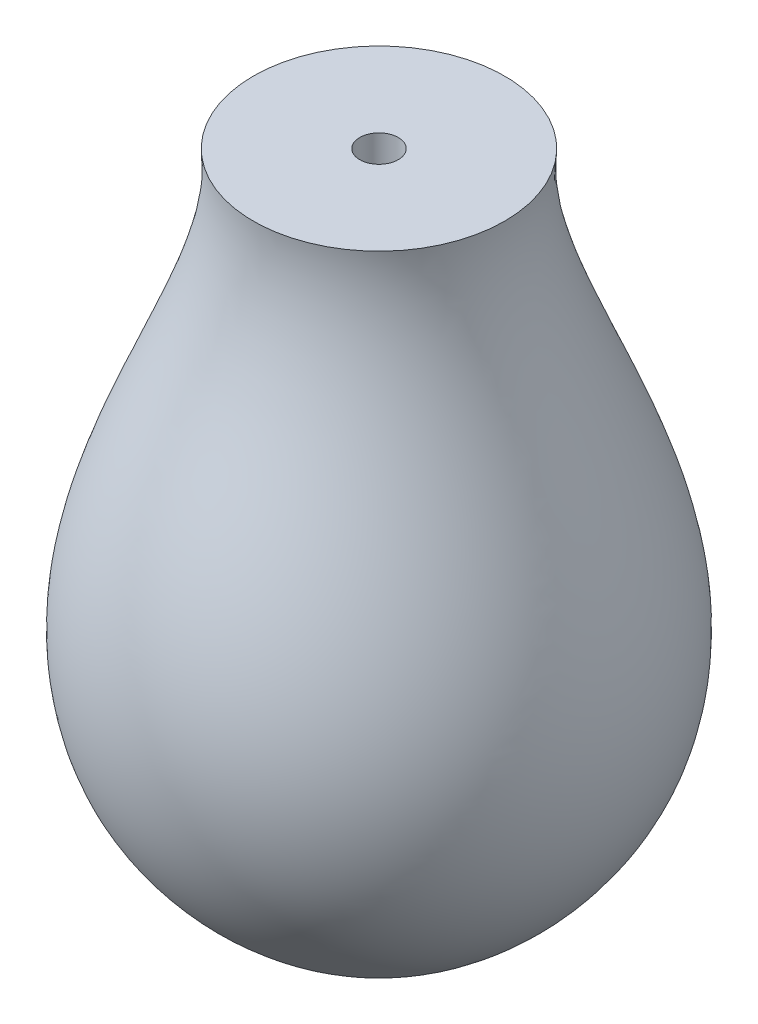
ISO-10303-21;
HEADER;
FILE_DESCRIPTION(('STEP AP214'),'2;1');
FILE_NAME('part.step','',(''),(''),'','','');
FILE_SCHEMA(('AUTOMOTIVE_DESIGN { 1 0 10303 214 1 1 1 1 }'));
ENDSEC;
DATA;
#1=APPLICATION_CONTEXT('core data for automotive mechanical design processes');
#2=APPLICATION_PROTOCOL_DEFINITION('international standard','automotive_design',2000,#1);
#3=PRODUCT_CONTEXT('',#1,'mechanical');
#4=PRODUCT('Part','Part','',(#3));
#5=PRODUCT_RELATED_PRODUCT_CATEGORY('part','',(#4));
#6=PRODUCT_DEFINITION_FORMATION('','',#4);
#7=PRODUCT_DEFINITION_CONTEXT('part definition',#1,'design');
#8=PRODUCT_DEFINITION('design','',#6,#7);
#9=PRODUCT_DEFINITION_SHAPE('','',#8);
#10=(LENGTH_UNIT() NAMED_UNIT(*) SI_UNIT(.MILLI.,.METRE.));
#11=(NAMED_UNIT(*) PLANE_ANGLE_UNIT() SI_UNIT($,.RADIAN.));
#12=(NAMED_UNIT(*) SI_UNIT($,.STERADIAN.) SOLID_ANGLE_UNIT());
#13=UNCERTAINTY_MEASURE_WITH_UNIT(LENGTH_MEASURE(1.E-05),#10,'distance_accuracy_value','');
#14=(GEOMETRIC_REPRESENTATION_CONTEXT(3) GLOBAL_UNCERTAINTY_ASSIGNED_CONTEXT((#13)) GLOBAL_UNIT_ASSIGNED_CONTEXT((#10,
#11,#12)) REPRESENTATION_CONTEXT('',''));
#15=CARTESIAN_POINT('',(0.,0.,0.));
#16=DIRECTION('',(0.,0.,1.));
#17=DIRECTION('',(1.,0.,0.));
#18=AXIS2_PLACEMENT_3D('',#15,#16,#17);
#19=CARTESIAN_POINT('',(0.,35.6197816052221,0.));
#20=DIRECTION('',(0.,-1.,0.));
#21=DIRECTION('',(1.,0.,0.));
#22=AXIS2_PLACEMENT_3D('',#19,#20,#21);
#23=CYLINDRICAL_SURFACE('',#22,1.15);
#24=CARTESIAN_POINT('',(0.,0.,0.));
#25=DIRECTION('',(0.,-1.,0.));
#26=DIRECTION('',(1.,0.,0.));
#27=AXIS2_PLACEMENT_3D('',#24,#25,#26);
#28=CIRCLE('',#27,1.15);
#29=CARTESIAN_POINT('',(1.15,0.,0.));
#30=VERTEX_POINT('',#29);
#31=EDGE_CURVE('E46',#30,#30,#28,.T.);
#32=ORIENTED_EDGE('',*,*,#31,.F.);
#33=EDGE_LOOP('',(#32));
#34=FACE_BOUND('',#33,.T.);
#35=CARTESIAN_POINT('',(0.,-10.,0.));
#36=DIRECTION('',(0.,-1.,0.));
#37=DIRECTION('',(1.,0.,0.));
#38=AXIS2_PLACEMENT_3D('',#35,#36,#37);
#39=CIRCLE('',#38,1.15);
#40=CARTESIAN_POINT('',(1.15,-10.,0.));
#41=VERTEX_POINT('',#40);
#42=EDGE_CURVE('E42',#41,#41,#39,.F.);
#43=ORIENTED_EDGE('',*,*,#42,.F.);
#44=EDGE_LOOP('',(#43));
#45=FACE_BOUND('',#44,.T.);
#46=ADVANCED_FACE('F38',(#34,#45),#23,.F.);
#47=CARTESIAN_POINT('',(0.,0.,0.));
#48=DIRECTION('',(0.,-1.,0.));
#49=DIRECTION('',(1.,0.,0.));
#50=AXIS2_PLACEMENT_3D('',#47,#48,#49);
#51=PLANE('',#50);
#52=ORIENTED_EDGE('',*,*,#31,.T.);
#53=EDGE_LOOP('',(#52));
#54=FACE_BOUND('',#53,.T.);
#55=CARTESIAN_POINT('',(0.,0.,0.));
#56=DIRECTION('',(0.,1.,0.));
#57=DIRECTION('',(-1.,0.,0.));
#58=AXIS2_PLACEMENT_3D('',#55,#56,#57);
#59=CIRCLE('',#58,7.5);
#60=CARTESIAN_POINT('',(-7.5,0.,0.));
#61=VERTEX_POINT('',#60);
#62=EDGE_CURVE('E10',#61,#61,#59,.T.);
#63=ORIENTED_EDGE('',*,*,#62,.T.);
#64=EDGE_LOOP('',(#63));
#65=FACE_BOUND('',#64,.T.);
#66=ADVANCED_FACE('F40',(#54,#65),#51,.F.);
#67=CARTESIAN_POINT('',(-7.5,0.,0.));
#68=CARTESIAN_POINT('',(-6.81470214166408,-7.2912149031231,0.));
#69=CARTESIAN_POINT('',(-15.2386695072232,-17.061394017091,0.));
#70=CARTESIAN_POINT('',(-13.0096578598788,-34.1942967000927,0.));
#71=CARTESIAN_POINT('',(-6.74971402321836,-38.8091008600244,0.));
#72=CARTESIAN_POINT('',(-2.60260925123155,-40.,0.));
#73=B_SPLINE_CURVE_WITH_KNOTS('',3,(#67,#68,#69,#70,#71,#72),.UNSPECIFIED.,.F.,.F.,(4,1,1,4),
(0.,0.538011165896247,0.631483352896742,1.),.UNSPECIFIED.);
#74=CARTESIAN_POINT('',(0.,0.,0.));
#75=DIRECTION('',(0.,1.,0.));
#76=AXIS1_PLACEMENT('',#74,#75);
#77=SURFACE_OF_REVOLUTION('',#73,#76);
#78=CARTESIAN_POINT('',(0.,-40.,0.));
#79=DIRECTION('',(0.,-1.,0.));
#80=DIRECTION('',(1.,0.,0.));
#81=AXIS2_PLACEMENT_3D('',#78,#79,#80);
#82=CIRCLE('',#81,2.60260925123155);
#83=CARTESIAN_POINT('',(2.60260925123156,-40.,0.));
#84=VERTEX_POINT('',#83);
#85=EDGE_CURVE('E82',#84,#84,#82,.T.);
#86=ORIENTED_EDGE('',*,*,#85,.F.);
#87=EDGE_LOOP('',(#86));
#88=FACE_BOUND('',#87,.T.);
#89=ORIENTED_EDGE('',*,*,#62,.F.);
#90=EDGE_LOOP('',(#89));
#91=FACE_BOUND('',#90,.T.);
#92=ADVANCED_FACE('F59',(#88,#91),#77,.F.);
#93=CARTESIAN_POINT('',(0.,-10.,0.));
#94=DIRECTION('',(0.,-1.,0.));
#95=DIRECTION('',(1.,0.,0.));
#96=AXIS2_PLACEMENT_3D('',#93,#94,#95);
#97=PLANE('',#96);
#98=CARTESIAN_POINT('',(0.,-10.,0.));
#99=DIRECTION('',(0.,-1.,0.));
#100=DIRECTION('',(1.,0.,0.));
#101=AXIS2_PLACEMENT_3D('',#98,#99,#100);
#102=CIRCLE('',#101,2.60260925123155);
#103=CARTESIAN_POINT('',(2.60260925123155,-10.,0.));
#104=VERTEX_POINT('',#103);
#105=EDGE_CURVE('E78',#104,#104,#102,.T.);
#106=ORIENTED_EDGE('',*,*,#105,.T.);
#107=EDGE_LOOP('',(#106));
#108=FACE_BOUND('',#107,.T.);
#109=ORIENTED_EDGE('',*,*,#42,.T.);
#110=EDGE_LOOP('',(#109));
#111=FACE_BOUND('',#110,.T.);
#112=ADVANCED_FACE('F62',(#108,#111),#97,.T.);
#113=CARTESIAN_POINT('',(0.,-10.,0.));
#114=DIRECTION('',(0.,-1.,0.));
#115=DIRECTION('',(1.,0.,0.));
#116=AXIS2_PLACEMENT_3D('',#113,#114,#115);
#117=CYLINDRICAL_SURFACE('',#116,2.60260925123155);
#118=ORIENTED_EDGE('',*,*,#105,.F.);
#119=EDGE_LOOP('',(#118));
#120=FACE_BOUND('',#119,.T.);
#121=ORIENTED_EDGE('',*,*,#85,.T.);
#122=EDGE_LOOP('',(#121));
#123=FACE_BOUND('',#122,.T.);
#124=ADVANCED_FACE('F67',(#120,#123),#117,.F.);
#125=CLOSED_SHELL('',(#46,#66,#92,#112,#124));
#126=MANIFOLD_SOLID_BREP('B2',#125);
#127=ADVANCED_BREP_SHAPE_REPRESENTATION('',(#18,#126),#14);
#128=SHAPE_DEFINITION_REPRESENTATION(#9,#127);
ENDSEC;
END-ISO-10303-21;
